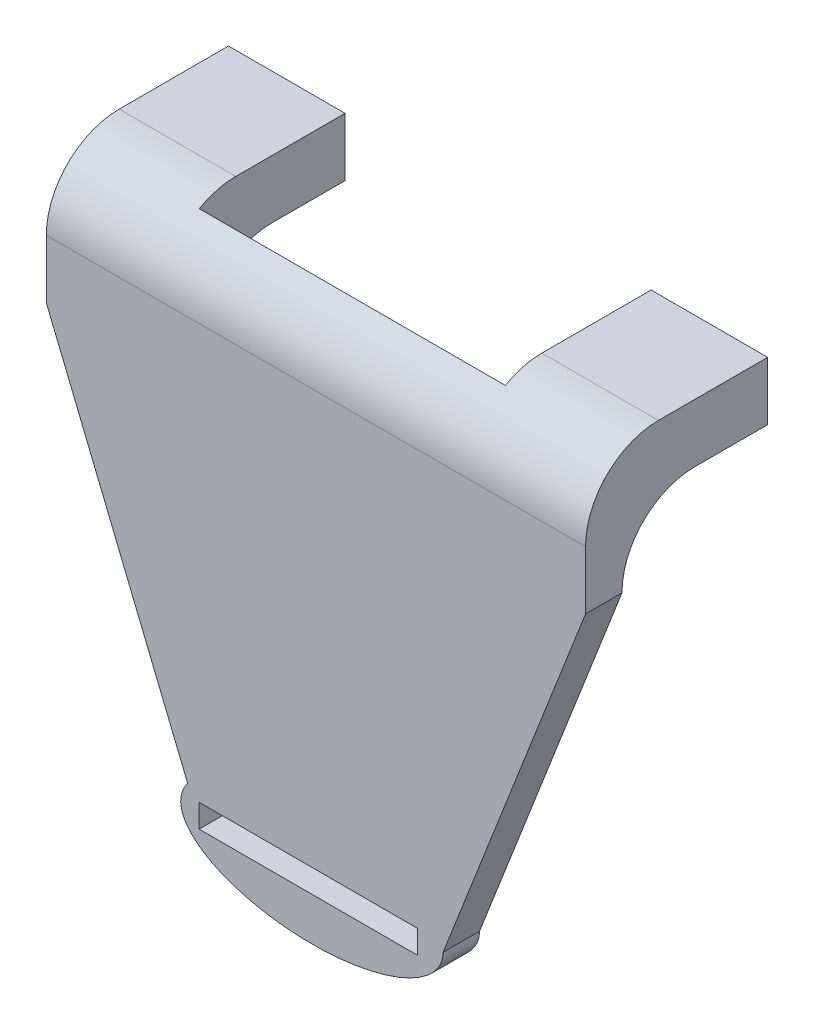
ISO-10303-21;
HEADER;
FILE_DESCRIPTION(('STEP AP214'),'2;1');
FILE_NAME('part.step','',(''),(''),'','','');
FILE_SCHEMA(('AUTOMOTIVE_DESIGN { 1 0 10303 214 1 1 1 1 }'));
ENDSEC;
DATA;
#1=APPLICATION_CONTEXT('core data for automotive mechanical design processes');
#2=APPLICATION_PROTOCOL_DEFINITION('international standard','automotive_design',2000,#1);
#3=PRODUCT_CONTEXT('',#1,'mechanical');
#4=PRODUCT('Part','Part','',(#3));
#5=PRODUCT_RELATED_PRODUCT_CATEGORY('part','',(#4));
#6=PRODUCT_DEFINITION_FORMATION('','',#4);
#7=PRODUCT_DEFINITION_CONTEXT('part definition',#1,'design');
#8=PRODUCT_DEFINITION('design','',#6,#7);
#9=PRODUCT_DEFINITION_SHAPE('','',#8);
#10=(LENGTH_UNIT() NAMED_UNIT(*) SI_UNIT(.MILLI.,.METRE.));
#11=(NAMED_UNIT(*) PLANE_ANGLE_UNIT() SI_UNIT($,.RADIAN.));
#12=(NAMED_UNIT(*) SI_UNIT($,.STERADIAN.) SOLID_ANGLE_UNIT());
#13=UNCERTAINTY_MEASURE_WITH_UNIT(LENGTH_MEASURE(1.E-05),#10,'distance_accuracy_value','');
#14=(GEOMETRIC_REPRESENTATION_CONTEXT(3) GLOBAL_UNCERTAINTY_ASSIGNED_CONTEXT((#13)) GLOBAL_UNIT_ASSIGNED_CONTEXT((#10,
#11,#12)) REPRESENTATION_CONTEXT('',''));
#15=CARTESIAN_POINT('',(0.,0.,0.));
#16=DIRECTION('',(0.,0.,1.));
#17=DIRECTION('',(1.,0.,0.));
#18=AXIS2_PLACEMENT_3D('',#15,#16,#17);
#19=CARTESIAN_POINT('',(38.,10.,-20.));
#20=DIRECTION('',(0.,1.,0.));
#21=DIRECTION('',(-1.,0.,0.));
#22=AXIS2_PLACEMENT_3D('',#19,#20,#21);
#23=PLANE('',#22);
#24=DIRECTION('',(0.,0.,1.));
#25=VECTOR('',#24,1.);
#26=CARTESIAN_POINT('',(38.,10.,-20.));
#27=LINE('',#26,#25);
#28=CARTESIAN_POINT('',(38.,10.,-20.));
#29=VERTEX_POINT('',#28);
#30=CARTESIAN_POINT('',(38.,10.,-10.));
#31=VERTEX_POINT('',#30);
#32=EDGE_CURVE('E346',#29,#31,#27,.T.);
#33=ORIENTED_EDGE('',*,*,#32,.T.);
#34=DIRECTION('',(-1.,0.,0.));
#35=VECTOR('',#34,1.);
#36=CARTESIAN_POINT('',(22.,10.,-10.));
#37=LINE('',#36,#35);
#38=CARTESIAN_POINT('',(34.,10.,-10.));
#39=VERTEX_POINT('',#38);
#40=EDGE_CURVE('E497',#31,#39,#37,.T.);
#41=ORIENTED_EDGE('',*,*,#40,.T.);
#42=DIRECTION('',(0.,0.,-1.));
#43=VECTOR('',#42,1.);
#44=CARTESIAN_POINT('',(34.,10.,-20.));
#45=LINE('',#44,#43);
#46=CARTESIAN_POINT('',(34.,10.,-20.));
#47=VERTEX_POINT('',#46);
#48=EDGE_CURVE('E284',#39,#47,#45,.T.);
#49=ORIENTED_EDGE('',*,*,#48,.T.);
#50=DIRECTION('',(-1.,0.,0.));
#51=VECTOR('',#50,1.);
#52=CARTESIAN_POINT('',(38.,10.,-20.));
#53=LINE('',#52,#51);
#54=EDGE_CURVE('E330',#29,#47,#53,.T.);
#55=ORIENTED_EDGE('',*,*,#54,.F.);
#56=EDGE_LOOP('',(#33,#41,#49,#55));
#57=FACE_BOUND('',#56,.T.);
#58=ADVANCED_FACE('F38',(#57),#23,.F.);
#59=CARTESIAN_POINT('',(-36.,10.,-20.));
#60=DIRECTION('',(0.,-1.,0.));
#61=DIRECTION('',(1.,0.,0.));
#62=AXIS2_PLACEMENT_3D('',#59,#60,#61);
#63=PLANE('',#62);
#64=DIRECTION('',(0.,0.,1.));
#65=VECTOR('',#64,1.);
#66=CARTESIAN_POINT('',(-20.,10.,-20.));
#67=LINE('',#66,#65);
#68=CARTESIAN_POINT('',(-20.,10.,-20.));
#69=VERTEX_POINT('',#68);
#70=CARTESIAN_POINT('',(-20.,10.,-10.));
#71=VERTEX_POINT('',#70);
#72=EDGE_CURVE('E321',#69,#71,#67,.T.);
#73=ORIENTED_EDGE('',*,*,#72,.T.);
#74=DIRECTION('',(1.,0.,0.));
#75=VECTOR('',#74,1.);
#76=CARTESIAN_POINT('',(-36.,10.,-10.));
#77=LINE('',#76,#75);
#78=CARTESIAN_POINT('',(-24.,10.,-10.));
#79=VERTEX_POINT('',#78);
#80=EDGE_CURVE('E584',#71,#79,#77,.F.);
#81=ORIENTED_EDGE('',*,*,#80,.T.);
#82=DIRECTION('',(0.,0.,-1.));
#83=VECTOR('',#82,1.);
#84=CARTESIAN_POINT('',(-24.,10.,-20.));
#85=LINE('',#84,#83);
#86=CARTESIAN_POINT('',(-24.,10.,-20.));
#87=VERTEX_POINT('',#86);
#88=EDGE_CURVE('E302',#79,#87,#85,.T.);
#89=ORIENTED_EDGE('',*,*,#88,.T.);
#90=DIRECTION('',(1.,0.,0.));
#91=VECTOR('',#90,1.);
#92=CARTESIAN_POINT('',(-36.,10.,-20.));
#93=LINE('',#92,#91);
#94=EDGE_CURVE('E255',#87,#69,#93,.T.);
#95=ORIENTED_EDGE('',*,*,#94,.T.);
#96=EDGE_LOOP('',(#73,#81,#89,#95));
#97=FACE_BOUND('',#96,.T.);
#98=ADVANCED_FACE('F462',(#97),#63,.T.);
#99=CARTESIAN_POINT('',(38.,18.,5.));
#100=DIRECTION('',(0.,-1.,0.));
#101=DIRECTION('',(1.,0.,0.));
#102=AXIS2_PLACEMENT_3D('',#99,#100,#101);
#103=PLANE('',#102);
#104=DIRECTION('',(0.,0.,-1.));
#105=VECTOR('',#104,1.);
#106=CARTESIAN_POINT('',(-36.,18.,5.));
#107=LINE('',#106,#105);
#108=CARTESIAN_POINT('',(-36.,18.,-5.));
#109=VERTEX_POINT('',#108);
#110=CARTESIAN_POINT('',(-36.,18.,-20.));
#111=VERTEX_POINT('',#110);
#112=EDGE_CURVE('E549',#109,#111,#107,.T.);
#113=ORIENTED_EDGE('',*,*,#112,.F.);
#114=DIRECTION('',(-1.,0.,0.));
#115=VECTOR('',#114,1.);
#116=CARTESIAN_POINT('',(38.,18.,-5.));
#117=LINE('',#116,#115);
#118=CARTESIAN_POINT('',(-20.,18.,-5.));
#119=VERTEX_POINT('',#118);
#120=EDGE_CURVE('E562',#109,#119,#117,.F.);
#121=ORIENTED_EDGE('',*,*,#120,.T.);
#122=DIRECTION('',(0.,0.,1.));
#123=VECTOR('',#122,1.);
#124=CARTESIAN_POINT('',(-20.,18.,-20.));
#125=LINE('',#124,#123);
#126=CARTESIAN_POINT('',(-20.,18.,-20.));
#127=VERTEX_POINT('',#126);
#128=EDGE_CURVE('E325',#127,#119,#125,.T.);
#129=ORIENTED_EDGE('',*,*,#128,.F.);
#130=DIRECTION('',(1.,0.,0.));
#131=VECTOR('',#130,1.);
#132=CARTESIAN_POINT('',(-36.,18.,-20.));
#133=LINE('',#132,#131);
#134=EDGE_CURVE('E306',#111,#127,#133,.T.);
#135=ORIENTED_EDGE('',*,*,#134,.F.);
#136=EDGE_LOOP('',(#113,#121,#129,#135));
#137=FACE_BOUND('',#136,.T.);
#138=ADVANCED_FACE('F442',(#137),#103,.F.);
#139=DIRECTION('',(0.,0.,1.));
#140=VECTOR('',#139,1.);
#141=CARTESIAN_POINT('',(26.,10.,-20.));
#142=LINE('',#141,#140);
#143=CARTESIAN_POINT('',(26.,10.,-20.));
#144=VERTEX_POINT('',#143);
#145=CARTESIAN_POINT('',(26.,10.,-10.));
#146=VERTEX_POINT('',#145);
#147=EDGE_CURVE('E274',#144,#146,#142,.T.);
#148=ORIENTED_EDGE('',*,*,#147,.T.);
#149=DIRECTION('',(-1.,0.,0.));
#150=VECTOR('',#149,1.);
#151=CARTESIAN_POINT('',(22.,10.,-10.));
#152=LINE('',#151,#150);
#153=CARTESIAN_POINT('',(22.,10.,-10.));
#154=VERTEX_POINT('',#153);
#155=EDGE_CURVE('E487',#146,#154,#152,.T.);
#156=ORIENTED_EDGE('',*,*,#155,.T.);
#157=DIRECTION('',(0.,0.,1.));
#158=VECTOR('',#157,1.);
#159=CARTESIAN_POINT('',(22.,10.,-20.));
#160=LINE('',#159,#158);
#161=CARTESIAN_POINT('',(22.,10.,-20.));
#162=VERTEX_POINT('',#161);
#163=EDGE_CURVE('E357',#162,#154,#160,.T.);
#164=ORIENTED_EDGE('',*,*,#163,.F.);
#165=EDGE_CURVE('E335',#144,#162,#53,.T.);
#166=ORIENTED_EDGE('',*,*,#165,.F.);
#167=EDGE_LOOP('',(#148,#156,#164,#166));
#168=FACE_BOUND('',#167,.T.);
#169=ADVANCED_FACE('F465',(#168),#23,.F.);
#170=CARTESIAN_POINT('',(0.,0.,-20.));
#171=DIRECTION('',(0.,0.,-1.));
#172=DIRECTION('',(-1.,0.,0.));
#173=AXIS2_PLACEMENT_3D('',#170,#171,#172);
#174=PLANE('',#173);
#175=ORIENTED_EDGE('',*,*,#54,.T.);
#176=DIRECTION('',(0.,-1.,0.));
#177=VECTOR('',#176,1.);
#178=CARTESIAN_POINT('',(34.,15.,-20.));
#179=LINE('',#178,#177);
#180=CARTESIAN_POINT('',(34.,15.,-20.));
#181=VERTEX_POINT('',#180);
#182=EDGE_CURVE('E298',#181,#47,#179,.T.);
#183=ORIENTED_EDGE('',*,*,#182,.F.);
#184=DIRECTION('',(-1.,0.,0.));
#185=VECTOR('',#184,1.);
#186=CARTESIAN_POINT('',(26.,15.,-20.));
#187=LINE('',#186,#185);
#188=CARTESIAN_POINT('',(26.,15.,-20.));
#189=VERTEX_POINT('',#188);
#190=EDGE_CURVE('E273',#181,#189,#187,.T.);
#191=ORIENTED_EDGE('',*,*,#190,.T.);
#192=DIRECTION('',(0.,-1.,0.));
#193=VECTOR('',#192,1.);
#194=CARTESIAN_POINT('',(26.,15.,-20.));
#195=LINE('',#194,#193);
#196=EDGE_CURVE('E294',#189,#144,#195,.T.);
#197=ORIENTED_EDGE('',*,*,#196,.T.);
#198=ORIENTED_EDGE('',*,*,#165,.T.);
#199=DIRECTION('',(0.,1.,0.));
#200=VECTOR('',#199,1.);
#201=CARTESIAN_POINT('',(22.,10.,-20.));
#202=LINE('',#201,#200);
#203=CARTESIAN_POINT('',(22.,18.,-20.));
#204=VERTEX_POINT('',#203);
#205=EDGE_CURVE('E334',#162,#204,#202,.T.);
#206=ORIENTED_EDGE('',*,*,#205,.T.);
#207=DIRECTION('',(-1.,0.,0.));
#208=VECTOR('',#207,1.);
#209=CARTESIAN_POINT('',(38.,18.,-20.));
#210=LINE('',#209,#208);
#211=CARTESIAN_POINT('',(38.,18.,-20.));
#212=VERTEX_POINT('',#211);
#213=EDGE_CURVE('E338',#212,#204,#210,.T.);
#214=ORIENTED_EDGE('',*,*,#213,.F.);
#215=DIRECTION('',(0.,1.,0.));
#216=VECTOR('',#215,1.);
#217=CARTESIAN_POINT('',(38.,10.,-20.));
#218=LINE('',#217,#216);
#219=EDGE_CURVE('E342',#29,#212,#218,.T.);
#220=ORIENTED_EDGE('',*,*,#219,.F.);
#221=EDGE_LOOP('',(#175,#183,#191,#197,#198,#206,#214,#220));
#222=FACE_BOUND('',#221,.T.);
#223=ADVANCED_FACE('F475',(#222),#174,.T.);
#224=DIRECTION('',(0.,0.,1.));
#225=VECTOR('',#224,1.);
#226=CARTESIAN_POINT('',(-32.,10.,-20.));
#227=LINE('',#226,#225);
#228=CARTESIAN_POINT('',(-32.,10.,-20.));
#229=VERTEX_POINT('',#228);
#230=CARTESIAN_POINT('',(-32.,10.,-10.));
#231=VERTEX_POINT('',#230);
#232=EDGE_CURVE('E251',#229,#231,#227,.T.);
#233=ORIENTED_EDGE('',*,*,#232,.T.);
#234=DIRECTION('',(1.,0.,0.));
#235=VECTOR('',#234,1.);
#236=CARTESIAN_POINT('',(-36.,10.,-10.));
#237=LINE('',#236,#235);
#238=CARTESIAN_POINT('',(-36.,10.,-10.));
#239=VERTEX_POINT('',#238);
#240=EDGE_CURVE('E581',#231,#239,#237,.F.);
#241=ORIENTED_EDGE('',*,*,#240,.T.);
#242=DIRECTION('',(0.,0.,1.));
#243=VECTOR('',#242,1.);
#244=CARTESIAN_POINT('',(-36.,10.,-20.));
#245=LINE('',#244,#243);
#246=CARTESIAN_POINT('',(-36.,10.,-20.));
#247=VERTEX_POINT('',#246);
#248=EDGE_CURVE('E316',#247,#239,#245,.T.);
#249=ORIENTED_EDGE('',*,*,#248,.F.);
#250=EDGE_CURVE('E313',#247,#229,#93,.T.);
#251=ORIENTED_EDGE('',*,*,#250,.T.);
#252=EDGE_LOOP('',(#233,#241,#249,#251));
#253=FACE_BOUND('',#252,.T.);
#254=ADVANCED_FACE('F472',(#253),#63,.T.);
#255=CARTESIAN_POINT('',(0.,0.,-20.));
#256=DIRECTION('',(0.,0.,-1.));
#257=DIRECTION('',(-1.,0.,0.));
#258=AXIS2_PLACEMENT_3D('',#255,#256,#257);
#259=PLANE('',#258);
#260=ORIENTED_EDGE('',*,*,#94,.F.);
#261=DIRECTION('',(0.,-1.,0.));
#262=VECTOR('',#261,1.);
#263=CARTESIAN_POINT('',(-24.,15.,-20.));
#264=LINE('',#263,#262);
#265=CARTESIAN_POINT('',(-24.,15.,-20.));
#266=VERTEX_POINT('',#265);
#267=EDGE_CURVE('E246',#266,#87,#264,.T.);
#268=ORIENTED_EDGE('',*,*,#267,.F.);
#269=DIRECTION('',(-1.,0.,0.));
#270=VECTOR('',#269,1.);
#271=CARTESIAN_POINT('',(-32.,15.,-20.));
#272=LINE('',#271,#270);
#273=CARTESIAN_POINT('',(-32.,15.,-20.));
#274=VERTEX_POINT('',#273);
#275=EDGE_CURVE('E229',#266,#274,#272,.T.);
#276=ORIENTED_EDGE('',*,*,#275,.T.);
#277=DIRECTION('',(0.,-1.,0.));
#278=VECTOR('',#277,1.);
#279=CARTESIAN_POINT('',(-32.,15.,-20.));
#280=LINE('',#279,#278);
#281=EDGE_CURVE('E258',#274,#229,#280,.T.);
#282=ORIENTED_EDGE('',*,*,#281,.T.);
#283=ORIENTED_EDGE('',*,*,#250,.F.);
#284=DIRECTION('',(0.,1.,0.));
#285=VECTOR('',#284,1.);
#286=CARTESIAN_POINT('',(-36.,10.,-20.));
#287=LINE('',#286,#285);
#288=EDGE_CURVE('E263',#247,#111,#287,.T.);
#289=ORIENTED_EDGE('',*,*,#288,.T.);
#290=ORIENTED_EDGE('',*,*,#134,.T.);
#291=DIRECTION('',(0.,1.,0.));
#292=VECTOR('',#291,1.);
#293=CARTESIAN_POINT('',(-20.,10.,-20.));
#294=LINE('',#293,#292);
#295=EDGE_CURVE('E309',#69,#127,#294,.T.);
#296=ORIENTED_EDGE('',*,*,#295,.F.);
#297=EDGE_LOOP('',(#260,#268,#276,#282,#283,#289,#290,#296));
#298=FACE_BOUND('',#297,.T.);
#299=ADVANCED_FACE('F253',(#298),#259,.T.);
#300=CARTESIAN_POINT('',(0.,0.,0.));
#301=DIRECTION('',(0.,0.,1.));
#302=DIRECTION('',(1.,0.,0.));
#303=AXIS2_PLACEMENT_3D('',#300,#301,#302);
#304=PLANE('',#303);
#305=DIRECTION('',(0.,1.,0.));
#306=VECTOR('',#305,1.);
#307=CARTESIAN_POINT('',(14.9650811620296,-48.8916910067312,0.));
#308=LINE('',#307,#306);
#309=CARTESIAN_POINT('',(14.9650811620296,-52.0899376672442,0.));
#310=VERTEX_POINT('',#309);
#311=CARTESIAN_POINT('',(14.9650811620296,-48.8916910067312,0.));
#312=VERTEX_POINT('',#311);
#313=EDGE_CURVE('E361',#310,#312,#308,.T.);
#314=ORIENTED_EDGE('',*,*,#313,.T.);
#315=DIRECTION('',(-1.,0.,0.));
#316=VECTOR('',#315,1.);
#317=CARTESIAN_POINT('',(-15.0349188379704,-48.8916910067312,0.));
#318=LINE('',#317,#316);
#319=CARTESIAN_POINT('',(-15.0349188379704,-48.8916910067312,0.));
#320=VERTEX_POINT('',#319);
#321=EDGE_CURVE('E380',#312,#320,#318,.T.);
#322=ORIENTED_EDGE('',*,*,#321,.T.);
#323=DIRECTION('',(0.,-1.,0.));
#324=VECTOR('',#323,1.);
#325=CARTESIAN_POINT('',(-15.0349188379704,-48.8916910067312,0.));
#326=LINE('',#325,#324);
#327=CARTESIAN_POINT('',(-15.0349188379704,-52.0899376672442,0.));
#328=VERTEX_POINT('',#327);
#329=EDGE_CURVE('E384',#320,#328,#326,.T.);
#330=ORIENTED_EDGE('',*,*,#329,.T.);
#331=DIRECTION('',(1.,0.,0.));
#332=VECTOR('',#331,1.);
#333=CARTESIAN_POINT('',(-15.0349188379704,-52.0899376672442,0.));
#334=LINE('',#333,#332);
#335=EDGE_CURVE('E366',#328,#310,#334,.T.);
#336=ORIENTED_EDGE('',*,*,#335,.T.);
#337=EDGE_LOOP('',(#314,#322,#330,#336));
#338=FACE_BOUND('',#337,.T.);
#339=DIRECTION('',(0.,1.,0.));
#340=VECTOR('',#339,1.);
#341=CARTESIAN_POINT('',(22.,10.,0.));
#342=LINE('',#341,#340);
#343=CARTESIAN_POINT('',(22.,0.,0.));
#344=VERTEX_POINT('',#343);
#345=CARTESIAN_POINT('',(22.,16.6602540378444,0.));
#346=VERTEX_POINT('',#345);
#347=EDGE_CURVE('E329',#344,#346,#342,.T.);
#348=ORIENTED_EDGE('',*,*,#347,.F.);
#349=DIRECTION('',(-1.,0.,0.));
#350=VECTOR('',#349,1.);
#351=CARTESIAN_POINT('',(38.,0.,0.));
#352=LINE('',#351,#350);
#353=CARTESIAN_POINT('',(38.,0.,0.));
#354=VERTEX_POINT('',#353);
#355=EDGE_CURVE('E503',#344,#354,#352,.F.);
#356=ORIENTED_EDGE('',*,*,#355,.T.);
#357=DIRECTION('',(0.364212990761324,0.931315680830454,0.));
#358=VECTOR('',#357,1.);
#359=CARTESIAN_POINT('',(18.4463192095855,-50.,0.));
#360=LINE('',#359,#358);
#361=CARTESIAN_POINT('',(18.4463192095855,-50.,0.));
#362=VERTEX_POINT('',#361);
#363=EDGE_CURVE('E527',#362,#354,#360,.T.);
#364=ORIENTED_EDGE('',*,*,#363,.F.);
#365=CARTESIAN_POINT('',(0.44631920958554,-50.,0.));
#366=DIRECTION('',(0.,0.,1.));
#367=DIRECTION('',(1.,0.,0.));
#368=AXIS2_PLACEMENT_3D('',#365,#366,#367);
#369=ELLIPSE('',#368,18.,8.);
#370=CARTESIAN_POINT('',(-16.6028618847083,-47.4343032515066,0.));
#371=VERTEX_POINT('',#370);
#372=EDGE_CURVE('E404',#371,#362,#369,.T.);
#373=ORIENTED_EDGE('',*,*,#372,.F.);
#374=DIRECTION('',(0.378502389569488,-0.92560031389914,0.));
#375=VECTOR('',#374,1.);
#376=CARTESIAN_POINT('',(-36.,0.,0.));
#377=LINE('',#376,#375);
#378=CARTESIAN_POINT('',(-36.,0.,0.));
#379=VERTEX_POINT('',#378);
#380=EDGE_CURVE('E537',#379,#371,#377,.T.);
#381=ORIENTED_EDGE('',*,*,#380,.F.);
#382=DIRECTION('',(1.,0.,0.));
#383=VECTOR('',#382,1.);
#384=CARTESIAN_POINT('',(0.,0.,0.));
#385=LINE('',#384,#383);
#386=CARTESIAN_POINT('',(-20.,0.,0.));
#387=VERTEX_POINT('',#386);
#388=EDGE_CURVE('E577',#379,#387,#385,.T.);
#389=ORIENTED_EDGE('',*,*,#388,.T.);
#390=DIRECTION('',(0.,1.,0.));
#391=VECTOR('',#390,1.);
#392=CARTESIAN_POINT('',(-20.,10.,0.));
#393=LINE('',#392,#391);
#394=CARTESIAN_POINT('',(-20.,16.6602540378444,0.));
#395=VERTEX_POINT('',#394);
#396=EDGE_CURVE('E257',#387,#395,#393,.T.);
#397=ORIENTED_EDGE('',*,*,#396,.T.);
#398=DIRECTION('',(1.,0.,0.));
#399=VECTOR('',#398,1.);
#400=CARTESIAN_POINT('',(-20.,16.6602540378444,0.));
#401=LINE('',#400,#399);
#402=EDGE_CURVE('E568',#395,#346,#401,.T.);
#403=ORIENTED_EDGE('',*,*,#402,.T.);
#404=EDGE_LOOP('',(#348,#356,#364,#373,#381,#389,#397,#403));
#405=FACE_BOUND('',#404,.T.);
#406=ADVANCED_FACE('F425',(#338,#405),#304,.F.);
#407=CARTESIAN_POINT('',(0.,0.,5.));
#408=DIRECTION('',(0.,0.,1.));
#409=DIRECTION('',(1.,0.,0.));
#410=AXIS2_PLACEMENT_3D('',#407,#408,#409);
#411=PLANE('',#410);
#412=DIRECTION('',(0.,1.,0.));
#413=VECTOR('',#412,1.);
#414=CARTESIAN_POINT('',(38.,0.,5.));
#415=LINE('',#414,#413);
#416=CARTESIAN_POINT('',(38.,0.,5.));
#417=VERTEX_POINT('',#416);
#418=CARTESIAN_POINT('',(38.,8.00000000000001,5.));
#419=VERTEX_POINT('',#418);
#420=EDGE_CURVE('E541',#417,#419,#415,.T.);
#421=ORIENTED_EDGE('',*,*,#420,.T.);
#422=DIRECTION('',(-1.,0.,0.));
#423=VECTOR('',#422,1.);
#424=CARTESIAN_POINT('',(-36.,8.,5.));
#425=LINE('',#424,#423);
#426=CARTESIAN_POINT('',(-36.,8.,5.));
#427=VERTEX_POINT('',#426);
#428=EDGE_CURVE('E547',#419,#427,#425,.T.);
#429=ORIENTED_EDGE('',*,*,#428,.T.);
#430=DIRECTION('',(0.,-1.,0.));
#431=VECTOR('',#430,1.);
#432=CARTESIAN_POINT('',(-36.,18.,5.));
#433=LINE('',#432,#431);
#434=CARTESIAN_POINT('',(-36.,0.,5.));
#435=VERTEX_POINT('',#434);
#436=EDGE_CURVE('E674',#427,#435,#433,.T.);
#437=ORIENTED_EDGE('',*,*,#436,.T.);
#438=DIRECTION('',(0.378502389569488,-0.92560031389914,0.));
#439=VECTOR('',#438,1.);
#440=CARTESIAN_POINT('',(-36.,0.,5.));
#441=LINE('',#440,#439);
#442=CARTESIAN_POINT('',(-16.6028618847083,-47.4343032515066,5.));
#443=VERTEX_POINT('',#442);
#444=EDGE_CURVE('E620',#435,#443,#441,.T.);
#445=ORIENTED_EDGE('',*,*,#444,.T.);
#446=CARTESIAN_POINT('',(0.44631920958554,-50.,5.));
#447=DIRECTION('',(0.,0.,1.));
#448=DIRECTION('',(1.,0.,0.));
#449=AXIS2_PLACEMENT_3D('',#446,#447,#448);
#450=ELLIPSE('',#449,18.,8.);
#451=CARTESIAN_POINT('',(18.4463192095855,-50.,5.));
#452=VERTEX_POINT('',#451);
#453=EDGE_CURVE('E405',#443,#452,#450,.T.);
#454=ORIENTED_EDGE('',*,*,#453,.T.);
#455=DIRECTION('',(0.364212990761324,0.931315680830454,0.));
#456=VECTOR('',#455,1.);
#457=CARTESIAN_POINT('',(18.4463192095855,-50.,5.));
#458=LINE('',#457,#456);
#459=EDGE_CURVE('E624',#452,#417,#458,.T.);
#460=ORIENTED_EDGE('',*,*,#459,.T.);
#461=EDGE_LOOP('',(#421,#429,#437,#445,#454,#460));
#462=FACE_BOUND('',#461,.T.);
#463=DIRECTION('',(-1.,0.,0.));
#464=VECTOR('',#463,1.);
#465=CARTESIAN_POINT('',(-15.0349188379704,-48.8916910067312,5.));
#466=LINE('',#465,#464);
#467=CARTESIAN_POINT('',(14.9650811620296,-48.8916910067312,5.));
#468=VERTEX_POINT('',#467);
#469=CARTESIAN_POINT('',(-15.0349188379704,-48.8916910067312,5.));
#470=VERTEX_POINT('',#469);
#471=EDGE_CURVE('E365',#468,#470,#466,.T.);
#472=ORIENTED_EDGE('',*,*,#471,.F.);
#473=DIRECTION('',(0.,1.,0.));
#474=VECTOR('',#473,1.);
#475=CARTESIAN_POINT('',(14.9650811620296,-48.8916910067312,5.));
#476=LINE('',#475,#474);
#477=CARTESIAN_POINT('',(14.9650811620296,-52.0899376672442,5.));
#478=VERTEX_POINT('',#477);
#479=EDGE_CURVE('E362',#478,#468,#476,.T.);
#480=ORIENTED_EDGE('',*,*,#479,.F.);
#481=DIRECTION('',(1.,0.,0.));
#482=VECTOR('',#481,1.);
#483=CARTESIAN_POINT('',(-15.0349188379704,-52.0899376672442,5.));
#484=LINE('',#483,#482);
#485=CARTESIAN_POINT('',(-15.0349188379704,-52.0899376672442,5.));
#486=VERTEX_POINT('',#485);
#487=EDGE_CURVE('E373',#486,#478,#484,.T.);
#488=ORIENTED_EDGE('',*,*,#487,.F.);
#489=DIRECTION('',(0.,-1.,0.));
#490=VECTOR('',#489,1.);
#491=CARTESIAN_POINT('',(-15.0349188379704,-48.8916910067312,5.));
#492=LINE('',#491,#490);
#493=EDGE_CURVE('E369',#470,#486,#492,.T.);
#494=ORIENTED_EDGE('',*,*,#493,.F.);
#495=EDGE_LOOP('',(#472,#480,#488,#494));
#496=FACE_BOUND('',#495,.T.);
#497=ADVANCED_FACE('F421',(#462,#496),#411,.T.);
#498=CARTESIAN_POINT('',(-36.,0.,5.));
#499=DIRECTION('',(0.92560031389914,0.378502389569488,0.));
#500=DIRECTION('',(-0.378502389569488,0.92560031389914,0.));
#501=AXIS2_PLACEMENT_3D('',#498,#499,#500);
#502=PLANE('',#501);
#503=DIRECTION('',(0.,0.,-1.));
#504=VECTOR('',#503,1.);
#505=CARTESIAN_POINT('',(-16.6028618847083,-47.4343032515066,5.));
#506=LINE('',#505,#504);
#507=EDGE_CURVE('E410',#443,#371,#506,.T.);
#508=ORIENTED_EDGE('',*,*,#507,.F.);
#509=ORIENTED_EDGE('',*,*,#444,.F.);
#510=DIRECTION('',(0.,0.,-1.));
#511=VECTOR('',#510,1.);
#512=CARTESIAN_POINT('',(-36.,0.,5.));
#513=LINE('',#512,#511);
#514=EDGE_CURVE('E614',#435,#379,#513,.T.);
#515=ORIENTED_EDGE('',*,*,#514,.T.);
#516=ORIENTED_EDGE('',*,*,#380,.T.);
#517=EDGE_LOOP('',(#508,#509,#515,#516));
#518=FACE_BOUND('',#517,.T.);
#519=ADVANCED_FACE('F424',(#518),#502,.F.);
#520=CARTESIAN_POINT('',(18.4463192095855,-50.,5.));
#521=DIRECTION('',(-0.931315680830454,0.364212990761324,0.));
#522=DIRECTION('',(-0.364212990761324,-0.931315680830454,0.));
#523=AXIS2_PLACEMENT_3D('',#520,#521,#522);
#524=PLANE('',#523);
#525=ORIENTED_EDGE('',*,*,#363,.T.);
#526=DIRECTION('',(0.,0.,-1.));
#527=VECTOR('',#526,1.);
#528=CARTESIAN_POINT('',(38.,0.,5.));
#529=LINE('',#528,#527);
#530=EDGE_CURVE('E531',#417,#354,#529,.T.);
#531=ORIENTED_EDGE('',*,*,#530,.F.);
#532=ORIENTED_EDGE('',*,*,#459,.F.);
#533=DIRECTION('',(0.,0.,-1.));
#534=VECTOR('',#533,1.);
#535=CARTESIAN_POINT('',(18.4463192095855,-50.,5.));
#536=LINE('',#535,#534);
#537=EDGE_CURVE('E534',#452,#362,#536,.T.);
#538=ORIENTED_EDGE('',*,*,#537,.T.);
#539=EDGE_LOOP('',(#525,#531,#532,#538));
#540=FACE_BOUND('',#539,.T.);
#541=ADVANCED_FACE('F432',(#540),#524,.F.);
#542=CARTESIAN_POINT('',(38.,0.,5.));
#543=DIRECTION('',(-1.,0.,0.));
#544=DIRECTION('',(0.,0.,1.));
#545=AXIS2_PLACEMENT_3D('',#542,#543,#544);
#546=PLANE('',#545);
#547=DIRECTION('',(0.,0.,-1.));
#548=VECTOR('',#547,1.);
#549=CARTESIAN_POINT('',(38.,18.,5.));
#550=LINE('',#549,#548);
#551=CARTESIAN_POINT('',(38.,18.,-5.));
#552=VERTEX_POINT('',#551);
#553=EDGE_CURVE('E543',#552,#212,#550,.T.);
#554=ORIENTED_EDGE('',*,*,#553,.F.);
#555=CARTESIAN_POINT('',(38.,8.00000000000001,-5.));
#556=DIRECTION('',(-1.,0.,0.));
#557=DIRECTION('',(0.,0.,1.));
#558=AXIS2_PLACEMENT_3D('',#555,#556,#557);
#559=CIRCLE('',#558,10.);
#560=EDGE_CURVE('E574',#552,#419,#559,.F.);
#561=ORIENTED_EDGE('',*,*,#560,.T.);
#562=ORIENTED_EDGE('',*,*,#420,.F.);
#563=ORIENTED_EDGE('',*,*,#530,.T.);
#564=CARTESIAN_POINT('',(38.,0.,-10.));
#565=DIRECTION('',(-1.,0.,0.));
#566=DIRECTION('',(0.,0.,1.));
#567=AXIS2_PLACEMENT_3D('',#564,#565,#566);
#568=CIRCLE('',#567,10.);
#569=EDGE_CURVE('E11',#354,#31,#568,.T.);
#570=ORIENTED_EDGE('',*,*,#569,.T.);
#571=ORIENTED_EDGE('',*,*,#32,.F.);
#572=ORIENTED_EDGE('',*,*,#219,.T.);
#573=EDGE_LOOP('',(#554,#561,#562,#563,#570,#571,#572));
#574=FACE_BOUND('',#573,.T.);
#575=ADVANCED_FACE('F440',(#574),#546,.F.);
#576=DIRECTION('',(0.,0.,1.));
#577=VECTOR('',#576,1.);
#578=CARTESIAN_POINT('',(22.,18.,-20.));
#579=LINE('',#578,#577);
#580=CARTESIAN_POINT('',(22.,18.,-5.));
#581=VERTEX_POINT('',#580);
#582=EDGE_CURVE('E353',#204,#581,#579,.T.);
#583=ORIENTED_EDGE('',*,*,#582,.T.);
#584=DIRECTION('',(-1.,0.,0.));
#585=VECTOR('',#584,1.);
#586=CARTESIAN_POINT('',(38.,18.,-5.));
#587=LINE('',#586,#585);
#588=EDGE_CURVE('E559',#581,#552,#587,.F.);
#589=ORIENTED_EDGE('',*,*,#588,.T.);
#590=ORIENTED_EDGE('',*,*,#553,.T.);
#591=ORIENTED_EDGE('',*,*,#213,.T.);
#592=EDGE_LOOP('',(#583,#589,#590,#591));
#593=FACE_BOUND('',#592,.T.);
#594=ADVANCED_FACE('F436',(#593),#103,.F.);
#595=CARTESIAN_POINT('',(-36.,18.,5.));
#596=DIRECTION('',(1.,0.,0.));
#597=DIRECTION('',(0.,0.,-1.));
#598=AXIS2_PLACEMENT_3D('',#595,#596,#597);
#599=PLANE('',#598);
#600=ORIENTED_EDGE('',*,*,#436,.F.);
#601=CARTESIAN_POINT('',(-36.,8.,-5.));
#602=DIRECTION('',(1.,0.,0.));
#603=DIRECTION('',(0.,0.,-1.));
#604=AXIS2_PLACEMENT_3D('',#601,#602,#603);
#605=CIRCLE('',#604,10.);
#606=EDGE_CURVE('E556',#427,#109,#605,.F.);
#607=ORIENTED_EDGE('',*,*,#606,.T.);
#608=ORIENTED_EDGE('',*,*,#112,.T.);
#609=ORIENTED_EDGE('',*,*,#288,.F.);
#610=ORIENTED_EDGE('',*,*,#248,.T.);
#611=CARTESIAN_POINT('',(-36.,0.,-10.));
#612=DIRECTION('',(1.,0.,0.));
#613=DIRECTION('',(0.,0.,-1.));
#614=AXIS2_PLACEMENT_3D('',#611,#612,#613);
#615=CIRCLE('',#614,10.);
#616=EDGE_CURVE('E498',#239,#379,#615,.T.);
#617=ORIENTED_EDGE('',*,*,#616,.T.);
#618=ORIENTED_EDGE('',*,*,#514,.F.);
#619=EDGE_LOOP('',(#600,#607,#608,#609,#610,#617,#618));
#620=FACE_BOUND('',#619,.T.);
#621=ADVANCED_FACE('F418',(#620),#599,.F.);
#622=DIRECTION('',(0.,0.,-1.));
#623=VECTOR('',#622,1.);
#624=SURFACE_OF_LINEAR_EXTRUSION('',#450,#623);
#625=ORIENTED_EDGE('',*,*,#372,.T.);
#626=ORIENTED_EDGE('',*,*,#537,.F.);
#627=ORIENTED_EDGE('',*,*,#453,.F.);
#628=ORIENTED_EDGE('',*,*,#507,.T.);
#629=EDGE_LOOP('',(#625,#626,#627,#628));
#630=FACE_BOUND('',#629,.T.);
#631=ADVANCED_FACE('F413',(#630),#624,.F.);
#632=CARTESIAN_POINT('',(14.9650811620296,-48.8916910067312,5.));
#633=DIRECTION('',(-1.,0.,0.));
#634=DIRECTION('',(0.,0.,1.));
#635=AXIS2_PLACEMENT_3D('',#632,#633,#634);
#636=PLANE('',#635);
#637=ORIENTED_EDGE('',*,*,#313,.F.);
#638=DIRECTION('',(0.,0.,-1.));
#639=VECTOR('',#638,1.);
#640=CARTESIAN_POINT('',(14.9650811620296,-52.0899376672442,5.));
#641=LINE('',#640,#639);
#642=EDGE_CURVE('E376',#478,#310,#641,.T.);
#643=ORIENTED_EDGE('',*,*,#642,.F.);
#644=ORIENTED_EDGE('',*,*,#479,.T.);
#645=DIRECTION('',(0.,0.,-1.));
#646=VECTOR('',#645,1.);
#647=CARTESIAN_POINT('',(14.9650811620296,-48.8916910067312,5.));
#648=LINE('',#647,#646);
#649=EDGE_CURVE('E400',#468,#312,#648,.T.);
#650=ORIENTED_EDGE('',*,*,#649,.T.);
#651=EDGE_LOOP('',(#637,#643,#644,#650));
#652=FACE_BOUND('',#651,.T.);
#653=ADVANCED_FACE('F417',(#652),#636,.T.);
#654=CARTESIAN_POINT('',(-15.0349188379704,-48.8916910067312,5.));
#655=DIRECTION('',(0.,-1.,0.));
#656=DIRECTION('',(0.,0.,-1.));
#657=AXIS2_PLACEMENT_3D('',#654,#655,#656);
#658=PLANE('',#657);
#659=ORIENTED_EDGE('',*,*,#321,.F.);
#660=ORIENTED_EDGE('',*,*,#649,.F.);
#661=ORIENTED_EDGE('',*,*,#471,.T.);
#662=DIRECTION('',(0.,0.,-1.));
#663=VECTOR('',#662,1.);
#664=CARTESIAN_POINT('',(-15.0349188379704,-48.8916910067312,5.));
#665=LINE('',#664,#663);
#666=EDGE_CURVE('E397',#470,#320,#665,.T.);
#667=ORIENTED_EDGE('',*,*,#666,.T.);
#668=EDGE_LOOP('',(#659,#660,#661,#667));
#669=FACE_BOUND('',#668,.T.);
#670=ADVANCED_FACE('F686',(#669),#658,.T.);
#671=CARTESIAN_POINT('',(-15.0349188379704,-48.8916910067312,5.));
#672=DIRECTION('',(1.,0.,0.));
#673=DIRECTION('',(0.,0.,-1.));
#674=AXIS2_PLACEMENT_3D('',#671,#672,#673);
#675=PLANE('',#674);
#676=ORIENTED_EDGE('',*,*,#329,.F.);
#677=ORIENTED_EDGE('',*,*,#666,.F.);
#678=ORIENTED_EDGE('',*,*,#493,.T.);
#679=DIRECTION('',(0.,0.,-1.));
#680=VECTOR('',#679,1.);
#681=CARTESIAN_POINT('',(-15.0349188379704,-52.0899376672442,5.));
#682=LINE('',#681,#680);
#683=EDGE_CURVE('E394',#486,#328,#682,.T.);
#684=ORIENTED_EDGE('',*,*,#683,.T.);
#685=EDGE_LOOP('',(#676,#677,#678,#684));
#686=FACE_BOUND('',#685,.T.);
#687=ADVANCED_FACE('F689',(#686),#675,.T.);
#688=CARTESIAN_POINT('',(-15.0349188379704,-52.0899376672442,5.));
#689=DIRECTION('',(0.,1.,0.));
#690=DIRECTION('',(0.,0.,1.));
#691=AXIS2_PLACEMENT_3D('',#688,#689,#690);
#692=PLANE('',#691);
#693=ORIENTED_EDGE('',*,*,#335,.F.);
#694=ORIENTED_EDGE('',*,*,#683,.F.);
#695=ORIENTED_EDGE('',*,*,#487,.T.);
#696=ORIENTED_EDGE('',*,*,#642,.T.);
#697=EDGE_LOOP('',(#693,#694,#695,#696));
#698=FACE_BOUND('',#697,.T.);
#699=ADVANCED_FACE('F694',(#698),#692,.T.);
#700=CARTESIAN_POINT('',(22.,10.,-20.));
#701=DIRECTION('',(1.,0.,0.));
#702=DIRECTION('',(0.,1.,0.));
#703=AXIS2_PLACEMENT_3D('',#700,#701,#702);
#704=PLANE('',#703);
#705=ORIENTED_EDGE('',*,*,#347,.T.);
#706=CARTESIAN_POINT('',(22.,8.00000000000001,-5.));
#707=DIRECTION('',(1.,0.,0.));
#708=DIRECTION('',(0.,1.,0.));
#709=AXIS2_PLACEMENT_3D('',#706,#707,#708);
#710=CIRCLE('',#709,10.);
#711=EDGE_CURVE('E571',#346,#581,#710,.F.);
#712=ORIENTED_EDGE('',*,*,#711,.T.);
#713=ORIENTED_EDGE('',*,*,#582,.F.);
#714=ORIENTED_EDGE('',*,*,#205,.F.);
#715=ORIENTED_EDGE('',*,*,#163,.T.);
#716=CARTESIAN_POINT('',(22.,0.,-10.));
#717=DIRECTION('',(1.,0.,0.));
#718=DIRECTION('',(0.,1.,0.));
#719=AXIS2_PLACEMENT_3D('',#716,#717,#718);
#720=CIRCLE('',#719,10.);
#721=EDGE_CURVE('E47',#154,#344,#720,.T.);
#722=ORIENTED_EDGE('',*,*,#721,.T.);
#723=EDGE_LOOP('',(#705,#712,#713,#714,#715,#722));
#724=FACE_BOUND('',#723,.T.);
#725=ADVANCED_FACE('F520',(#724),#704,.F.);
#726=CARTESIAN_POINT('',(-20.,10.,-20.));
#727=DIRECTION('',(1.,0.,0.));
#728=DIRECTION('',(0.,1.,0.));
#729=AXIS2_PLACEMENT_3D('',#726,#727,#728);
#730=PLANE('',#729);
#731=ORIENTED_EDGE('',*,*,#128,.T.);
#732=CARTESIAN_POINT('',(-20.,8.,-5.));
#733=DIRECTION('',(1.,0.,0.));
#734=DIRECTION('',(0.,1.,0.));
#735=AXIS2_PLACEMENT_3D('',#732,#733,#734);
#736=CIRCLE('',#735,10.);
#737=EDGE_CURVE('E565',#119,#395,#736,.T.);
#738=ORIENTED_EDGE('',*,*,#737,.T.);
#739=ORIENTED_EDGE('',*,*,#396,.F.);
#740=CARTESIAN_POINT('',(-20.,0.,-10.));
#741=DIRECTION('',(1.,0.,0.));
#742=DIRECTION('',(0.,1.,0.));
#743=AXIS2_PLACEMENT_3D('',#740,#741,#742);
#744=CIRCLE('',#743,10.);
#745=EDGE_CURVE('E587',#387,#71,#744,.F.);
#746=ORIENTED_EDGE('',*,*,#745,.T.);
#747=ORIENTED_EDGE('',*,*,#72,.F.);
#748=ORIENTED_EDGE('',*,*,#295,.T.);
#749=EDGE_LOOP('',(#731,#738,#739,#746,#747,#748));
#750=FACE_BOUND('',#749,.T.);
#751=ADVANCED_FACE('F649',(#750),#730,.T.);
#752=CARTESIAN_POINT('',(-24.,15.,-20.));
#753=DIRECTION('',(-1.,0.,0.));
#754=DIRECTION('',(0.,0.,1.));
#755=AXIS2_PLACEMENT_3D('',#752,#753,#754);
#756=PLANE('',#755);
#757=ORIENTED_EDGE('',*,*,#88,.F.);
#758=CARTESIAN_POINT('',(-24.,0.,-10.));
#759=DIRECTION('',(-1.,0.,0.));
#760=DIRECTION('',(0.,0.,1.));
#761=AXIS2_PLACEMENT_3D('',#758,#759,#760);
#762=CIRCLE('',#761,10.);
#763=CARTESIAN_POINT('',(-24.,8.66025403784438,-5.));
#764=VERTEX_POINT('',#763);
#765=EDGE_CURVE('E590',#79,#764,#762,.F.);
#766=ORIENTED_EDGE('',*,*,#765,.T.);
#767=DIRECTION('',(0.,-1.,0.));
#768=VECTOR('',#767,1.);
#769=CARTESIAN_POINT('',(-24.,15.,-5.));
#770=LINE('',#769,#768);
#771=CARTESIAN_POINT('',(-24.,15.,-5.));
#772=VERTEX_POINT('',#771);
#773=EDGE_CURVE('E249',#772,#764,#770,.T.);
#774=ORIENTED_EDGE('',*,*,#773,.F.);
#775=DIRECTION('',(0.,0.,-1.));
#776=VECTOR('',#775,1.);
#777=CARTESIAN_POINT('',(-24.,15.,-20.));
#778=LINE('',#777,#776);
#779=EDGE_CURVE('E233',#772,#266,#778,.T.);
#780=ORIENTED_EDGE('',*,*,#779,.T.);
#781=ORIENTED_EDGE('',*,*,#267,.T.);
#782=EDGE_LOOP('',(#757,#766,#774,#780,#781));
#783=FACE_BOUND('',#782,.T.);
#784=ADVANCED_FACE('F245',(#783),#756,.T.);
#785=CARTESIAN_POINT('',(-32.,15.,-20.));
#786=DIRECTION('',(1.,0.,0.));
#787=DIRECTION('',(0.,0.,-1.));
#788=AXIS2_PLACEMENT_3D('',#785,#786,#787);
#789=PLANE('',#788);
#790=ORIENTED_EDGE('',*,*,#232,.F.);
#791=ORIENTED_EDGE('',*,*,#281,.F.);
#792=DIRECTION('',(0.,0.,1.));
#793=VECTOR('',#792,1.);
#794=CARTESIAN_POINT('',(-32.,15.,-20.));
#795=LINE('',#794,#793);
#796=CARTESIAN_POINT('',(-32.,15.,-5.));
#797=VERTEX_POINT('',#796);
#798=EDGE_CURVE('E234',#274,#797,#795,.T.);
#799=ORIENTED_EDGE('',*,*,#798,.T.);
#800=DIRECTION('',(0.,-1.,0.));
#801=VECTOR('',#800,1.);
#802=CARTESIAN_POINT('',(-32.,15.,-5.));
#803=LINE('',#802,#801);
#804=CARTESIAN_POINT('',(-32.,8.66025403784438,-5.));
#805=VERTEX_POINT('',#804);
#806=EDGE_CURVE('E265',#797,#805,#803,.T.);
#807=ORIENTED_EDGE('',*,*,#806,.T.);
#808=CARTESIAN_POINT('',(-32.,0.,-10.));
#809=DIRECTION('',(1.,0.,0.));
#810=DIRECTION('',(0.,0.,-1.));
#811=AXIS2_PLACEMENT_3D('',#808,#809,#810);
#812=CIRCLE('',#811,10.);
#813=EDGE_CURVE('E505',#805,#231,#812,.F.);
#814=ORIENTED_EDGE('',*,*,#813,.T.);
#815=EDGE_LOOP('',(#790,#791,#799,#807,#814));
#816=FACE_BOUND('',#815,.T.);
#817=ADVANCED_FACE('F600',(#816),#789,.T.);
#818=CARTESIAN_POINT('',(-32.,15.,-5.));
#819=DIRECTION('',(0.,0.,-1.));
#820=DIRECTION('',(-1.,0.,0.));
#821=AXIS2_PLACEMENT_3D('',#818,#819,#820);
#822=PLANE('',#821);
#823=ORIENTED_EDGE('',*,*,#773,.T.);
#824=DIRECTION('',(1.,0.,0.));
#825=VECTOR('',#824,1.);
#826=CARTESIAN_POINT('',(-24.,8.66025403784438,-5.));
#827=LINE('',#826,#825);
#828=EDGE_CURVE('E593',#764,#805,#827,.F.);
#829=ORIENTED_EDGE('',*,*,#828,.T.);
#830=ORIENTED_EDGE('',*,*,#806,.F.);
#831=DIRECTION('',(1.,0.,0.));
#832=VECTOR('',#831,1.);
#833=CARTESIAN_POINT('',(-32.,15.,-5.));
#834=LINE('',#833,#832);
#835=EDGE_CURVE('E635',#797,#772,#834,.T.);
#836=ORIENTED_EDGE('',*,*,#835,.T.);
#837=EDGE_LOOP('',(#823,#829,#830,#836));
#838=FACE_BOUND('',#837,.T.);
#839=ADVANCED_FACE('F638',(#838),#822,.T.);
#840=CARTESIAN_POINT('',(0.,15.,0.));
#841=DIRECTION('',(0.,1.,0.));
#842=DIRECTION('',(0.,0.,1.));
#843=AXIS2_PLACEMENT_3D('',#840,#841,#842);
#844=PLANE('',#843);
#845=ORIENTED_EDGE('',*,*,#779,.F.);
#846=ORIENTED_EDGE('',*,*,#835,.F.);
#847=ORIENTED_EDGE('',*,*,#798,.F.);
#848=ORIENTED_EDGE('',*,*,#275,.F.);
#849=EDGE_LOOP('',(#845,#846,#847,#848));
#850=FACE_BOUND('',#849,.T.);
#851=ADVANCED_FACE('F231',(#850),#844,.F.);
#852=CARTESIAN_POINT('',(34.,15.,-20.));
#853=DIRECTION('',(-1.,0.,0.));
#854=DIRECTION('',(0.,0.,1.));
#855=AXIS2_PLACEMENT_3D('',#852,#853,#854);
#856=PLANE('',#855);
#857=ORIENTED_EDGE('',*,*,#48,.F.);
#858=CARTESIAN_POINT('',(34.,0.,-10.));
#859=DIRECTION('',(-1.,0.,0.));
#860=DIRECTION('',(0.,0.,1.));
#861=AXIS2_PLACEMENT_3D('',#858,#859,#860);
#862=CIRCLE('',#861,10.);
#863=CARTESIAN_POINT('',(34.,8.66025403784439,-5.));
#864=VERTEX_POINT('',#863);
#865=EDGE_CURVE('E511',#39,#864,#862,.F.);
#866=ORIENTED_EDGE('',*,*,#865,.T.);
#867=DIRECTION('',(0.,-1.,0.));
#868=VECTOR('',#867,1.);
#869=CARTESIAN_POINT('',(34.,15.,-5.));
#870=LINE('',#869,#868);
#871=CARTESIAN_POINT('',(34.,15.,-5.));
#872=VERTEX_POINT('',#871);
#873=EDGE_CURVE('E61',#872,#864,#870,.T.);
#874=ORIENTED_EDGE('',*,*,#873,.F.);
#875=DIRECTION('',(0.,0.,-1.));
#876=VECTOR('',#875,1.);
#877=CARTESIAN_POINT('',(34.,15.,-20.));
#878=LINE('',#877,#876);
#879=EDGE_CURVE('E269',#872,#181,#878,.T.);
#880=ORIENTED_EDGE('',*,*,#879,.T.);
#881=ORIENTED_EDGE('',*,*,#182,.T.);
#882=EDGE_LOOP('',(#857,#866,#874,#880,#881));
#883=FACE_BOUND('',#882,.T.);
#884=ADVANCED_FACE('F661',(#883),#856,.T.);
#885=CARTESIAN_POINT('',(26.,15.,-20.));
#886=DIRECTION('',(1.,0.,0.));
#887=DIRECTION('',(0.,0.,-1.));
#888=AXIS2_PLACEMENT_3D('',#885,#886,#887);
#889=PLANE('',#888);
#890=ORIENTED_EDGE('',*,*,#147,.F.);
#891=ORIENTED_EDGE('',*,*,#196,.F.);
#892=DIRECTION('',(0.,0.,1.));
#893=VECTOR('',#892,1.);
#894=CARTESIAN_POINT('',(26.,15.,-20.));
#895=LINE('',#894,#893);
#896=CARTESIAN_POINT('',(26.,15.,-5.));
#897=VERTEX_POINT('',#896);
#898=EDGE_CURVE('E278',#189,#897,#895,.T.);
#899=ORIENTED_EDGE('',*,*,#898,.T.);
#900=DIRECTION('',(0.,-1.,0.));
#901=VECTOR('',#900,1.);
#902=CARTESIAN_POINT('',(26.,15.,-5.));
#903=LINE('',#902,#901);
#904=CARTESIAN_POINT('',(26.,8.66025403784439,-5.));
#905=VERTEX_POINT('',#904);
#906=EDGE_CURVE('E54',#897,#905,#903,.T.);
#907=ORIENTED_EDGE('',*,*,#906,.T.);
#908=CARTESIAN_POINT('',(26.,0.,-10.));
#909=DIRECTION('',(1.,0.,0.));
#910=DIRECTION('',(0.,0.,-1.));
#911=AXIS2_PLACEMENT_3D('',#908,#909,#910);
#912=CIRCLE('',#911,10.);
#913=EDGE_CURVE('E493',#905,#146,#912,.F.);
#914=ORIENTED_EDGE('',*,*,#913,.T.);
#915=EDGE_LOOP('',(#890,#891,#899,#907,#914));
#916=FACE_BOUND('',#915,.T.);
#917=ADVANCED_FACE('F665',(#916),#889,.T.);
#918=CARTESIAN_POINT('',(26.,15.,-5.));
#919=DIRECTION('',(0.,0.,-1.));
#920=DIRECTION('',(-1.,0.,0.));
#921=AXIS2_PLACEMENT_3D('',#918,#919,#920);
#922=PLANE('',#921);
#923=ORIENTED_EDGE('',*,*,#873,.T.);
#924=DIRECTION('',(1.,0.,0.));
#925=VECTOR('',#924,1.);
#926=CARTESIAN_POINT('',(34.,8.66025403784439,-5.));
#927=LINE('',#926,#925);
#928=EDGE_CURVE('E514',#864,#905,#927,.F.);
#929=ORIENTED_EDGE('',*,*,#928,.T.);
#930=ORIENTED_EDGE('',*,*,#906,.F.);
#931=DIRECTION('',(1.,0.,0.));
#932=VECTOR('',#931,1.);
#933=CARTESIAN_POINT('',(26.,15.,-5.));
#934=LINE('',#933,#932);
#935=EDGE_CURVE('E281',#897,#872,#934,.T.);
#936=ORIENTED_EDGE('',*,*,#935,.T.);
#937=EDGE_LOOP('',(#923,#929,#930,#936));
#938=FACE_BOUND('',#937,.T.);
#939=ADVANCED_FACE('F831',(#938),#922,.T.);
#940=CARTESIAN_POINT('',(0.,15.,0.));
#941=DIRECTION('',(0.,1.,0.));
#942=DIRECTION('',(0.,0.,1.));
#943=AXIS2_PLACEMENT_3D('',#940,#941,#942);
#944=PLANE('',#943);
#945=ORIENTED_EDGE('',*,*,#879,.F.);
#946=ORIENTED_EDGE('',*,*,#935,.F.);
#947=ORIENTED_EDGE('',*,*,#898,.F.);
#948=ORIENTED_EDGE('',*,*,#190,.F.);
#949=EDGE_LOOP('',(#945,#946,#947,#948));
#950=FACE_BOUND('',#949,.T.);
#951=ADVANCED_FACE('F452',(#950),#944,.F.);
#952=CARTESIAN_POINT('',(0.,8.00000000000001,-5.));
#953=DIRECTION('',(1.,0.,0.));
#954=DIRECTION('',(0.,1.,0.));
#955=AXIS2_PLACEMENT_3D('',#952,#953,#954);
#956=CYLINDRICAL_SURFACE('',#955,10.);
#957=ORIENTED_EDGE('',*,*,#737,.F.);
#958=ORIENTED_EDGE('',*,*,#120,.F.);
#959=ORIENTED_EDGE('',*,*,#606,.F.);
#960=ORIENTED_EDGE('',*,*,#428,.F.);
#961=ORIENTED_EDGE('',*,*,#560,.F.);
#962=ORIENTED_EDGE('',*,*,#588,.F.);
#963=ORIENTED_EDGE('',*,*,#711,.F.);
#964=ORIENTED_EDGE('',*,*,#402,.F.);
#965=EDGE_LOOP('',(#957,#958,#959,#960,#961,#962,#963,#964));
#966=FACE_BOUND('',#965,.T.);
#967=ADVANCED_FACE('F449',(#966),#956,.T.);
#968=CARTESIAN_POINT('',(0.,0.,-10.));
#969=DIRECTION('',(1.,0.,0.));
#970=DIRECTION('',(0.,1.,0.));
#971=AXIS2_PLACEMENT_3D('',#968,#969,#970);
#972=CYLINDRICAL_SURFACE('',#971,10.);
#973=ORIENTED_EDGE('',*,*,#765,.F.);
#974=ORIENTED_EDGE('',*,*,#80,.F.);
#975=ORIENTED_EDGE('',*,*,#745,.F.);
#976=ORIENTED_EDGE('',*,*,#388,.F.);
#977=ORIENTED_EDGE('',*,*,#616,.F.);
#978=ORIENTED_EDGE('',*,*,#240,.F.);
#979=ORIENTED_EDGE('',*,*,#813,.F.);
#980=ORIENTED_EDGE('',*,*,#828,.F.);
#981=EDGE_LOOP('',(#973,#974,#975,#976,#977,#978,#979,#980));
#982=FACE_BOUND('',#981,.T.);
#983=ADVANCED_FACE('F451',(#982),#972,.F.);
#984=CARTESIAN_POINT('',(38.,0.,-10.));
#985=DIRECTION('',(1.,0.,0.));
#986=DIRECTION('',(0.,1.,0.));
#987=AXIS2_PLACEMENT_3D('',#984,#985,#986);
#988=CYLINDRICAL_SURFACE('',#987,10.);
#989=ORIENTED_EDGE('',*,*,#569,.F.);
#990=ORIENTED_EDGE('',*,*,#355,.F.);
#991=ORIENTED_EDGE('',*,*,#721,.F.);
#992=ORIENTED_EDGE('',*,*,#155,.F.);
#993=ORIENTED_EDGE('',*,*,#913,.F.);
#994=ORIENTED_EDGE('',*,*,#928,.F.);
#995=ORIENTED_EDGE('',*,*,#865,.F.);
#996=ORIENTED_EDGE('',*,*,#40,.F.);
#997=EDGE_LOOP('',(#989,#990,#991,#992,#993,#994,#995,#996));
#998=FACE_BOUND('',#997,.T.);
#999=ADVANCED_FACE('F40',(#998),#988,.F.);
#1000=CLOSED_SHELL('',(#58,#98,#138,#169,#223,#254,#299,#406,#497,#519,#541,#575,#594,#621,#631,
#653,#670,#687,#699,#725,#751,#784,#817,#839,#851,#884,#917,#939,#951,#967,#983,#999));
#1001=MANIFOLD_SOLID_BREP('B2',#1000);
#1002=ADVANCED_BREP_SHAPE_REPRESENTATION('',(#18,#1001),#14);
#1003=SHAPE_DEFINITION_REPRESENTATION(#9,#1002);
ENDSEC;
END-ISO-10303-21;
